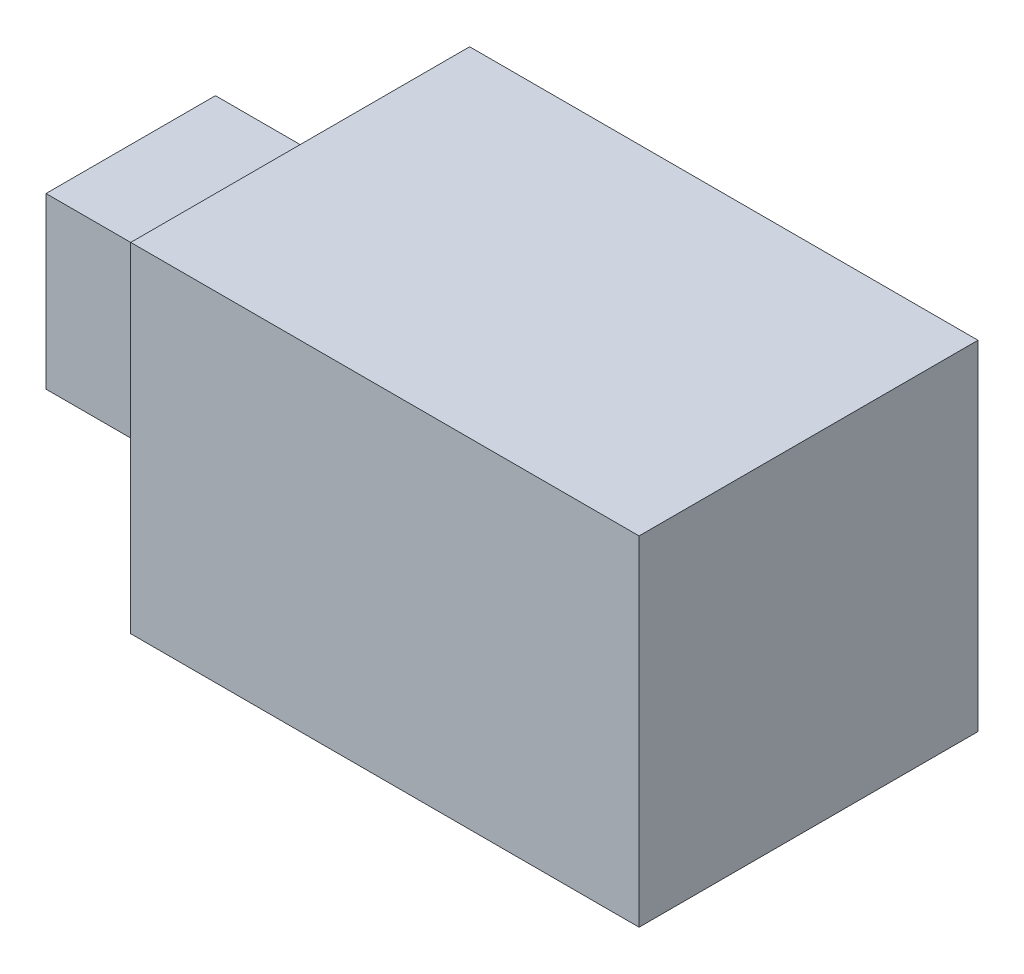
ISO-10303-21;
HEADER;
FILE_DESCRIPTION(('STEP AP214'),'2;1');
FILE_NAME('part.step','',(''),(''),'','','');
FILE_SCHEMA(('AUTOMOTIVE_DESIGN { 1 0 10303 214 1 1 1 1 }'));
ENDSEC;
DATA;
#1=APPLICATION_CONTEXT('core data for automotive mechanical design processes');
#2=APPLICATION_PROTOCOL_DEFINITION('international standard','automotive_design',2000,#1);
#3=PRODUCT_CONTEXT('',#1,'mechanical');
#4=PRODUCT('Part','Part','',(#3));
#5=PRODUCT_RELATED_PRODUCT_CATEGORY('part','',(#4));
#6=PRODUCT_DEFINITION_FORMATION('','',#4);
#7=PRODUCT_DEFINITION_CONTEXT('part definition',#1,'design');
#8=PRODUCT_DEFINITION('design','',#6,#7);
#9=PRODUCT_DEFINITION_SHAPE('','',#8);
#10=(LENGTH_UNIT() NAMED_UNIT(*) SI_UNIT(.MILLI.,.METRE.));
#11=(NAMED_UNIT(*) PLANE_ANGLE_UNIT() SI_UNIT($,.RADIAN.));
#12=(NAMED_UNIT(*) SI_UNIT($,.STERADIAN.) SOLID_ANGLE_UNIT());
#13=UNCERTAINTY_MEASURE_WITH_UNIT(LENGTH_MEASURE(1.E-05),#10,'distance_accuracy_value','');
#14=(GEOMETRIC_REPRESENTATION_CONTEXT(3) GLOBAL_UNCERTAINTY_ASSIGNED_CONTEXT((#13)) GLOBAL_UNIT_ASSIGNED_CONTEXT((#10,
#11,#12)) REPRESENTATION_CONTEXT('',''));
#15=CARTESIAN_POINT('',(0.,0.,0.));
#16=DIRECTION('',(0.,0.,1.));
#17=DIRECTION('',(1.,0.,0.));
#18=AXIS2_PLACEMENT_3D('',#15,#16,#17);
#19=CARTESIAN_POINT('',(12.7,6.35,-6.35));
#20=DIRECTION('',(0.,0.,1.));
#21=DIRECTION('',(0.,-1.,0.));
#22=AXIS2_PLACEMENT_3D('',#19,#20,#21);
#23=PLANE('',#22);
#24=DIRECTION('',(0.,1.,0.));
#25=VECTOR('',#24,1.);
#26=CARTESIAN_POINT('',(0.,6.35,-6.35));
#27=LINE('',#26,#25);
#28=CARTESIAN_POINT('',(0.,-6.35,-6.35));
#29=VERTEX_POINT('',#28);
#30=CARTESIAN_POINT('',(0.,6.35,-6.35));
#31=VERTEX_POINT('',#30);
#32=EDGE_CURVE('E147',#29,#31,#27,.T.);
#33=ORIENTED_EDGE('',*,*,#32,.T.);
#34=DIRECTION('',(-1.,0.,0.));
#35=VECTOR('',#34,1.);
#36=CARTESIAN_POINT('',(12.7,6.35,-6.35));
#37=LINE('',#36,#35);
#38=CARTESIAN_POINT('',(12.7,6.35,-6.35));
#39=VERTEX_POINT('',#38);
#40=EDGE_CURVE('E11',#39,#31,#37,.T.);
#41=ORIENTED_EDGE('',*,*,#40,.F.);
#42=DIRECTION('',(0.,1.,0.));
#43=VECTOR('',#42,1.);
#44=CARTESIAN_POINT('',(12.7,6.35,-6.35));
#45=LINE('',#44,#43);
#46=CARTESIAN_POINT('',(12.7,-6.35,-6.35));
#47=VERTEX_POINT('',#46);
#48=EDGE_CURVE('E158',#47,#39,#45,.T.);
#49=ORIENTED_EDGE('',*,*,#48,.F.);
#50=DIRECTION('',(-1.,0.,0.));
#51=VECTOR('',#50,1.);
#52=CARTESIAN_POINT('',(12.7,-6.35,-6.35));
#53=LINE('',#52,#51);
#54=EDGE_CURVE('E171',#47,#29,#53,.T.);
#55=ORIENTED_EDGE('',*,*,#54,.T.);
#56=EDGE_LOOP('',(#33,#41,#49,#55));
#57=FACE_BOUND('',#56,.T.);
#58=ADVANCED_FACE('F45',(#57),#23,.F.);
#59=CARTESIAN_POINT('',(12.7,6.35,6.35));
#60=DIRECTION('',(0.,-1.,0.));
#61=DIRECTION('',(0.,0.,-1.));
#62=AXIS2_PLACEMENT_3D('',#59,#60,#61);
#63=PLANE('',#62);
#64=DIRECTION('',(0.,0.,1.));
#65=VECTOR('',#64,1.);
#66=CARTESIAN_POINT('',(0.,6.35,6.35));
#67=LINE('',#66,#65);
#68=CARTESIAN_POINT('',(0.,6.35,6.35));
#69=VERTEX_POINT('',#68);
#70=EDGE_CURVE('E152',#31,#69,#67,.T.);
#71=ORIENTED_EDGE('',*,*,#70,.T.);
#72=DIRECTION('',(-1.,0.,0.));
#73=VECTOR('',#72,1.);
#74=CARTESIAN_POINT('',(12.7,6.35,6.35));
#75=LINE('',#74,#73);
#76=CARTESIAN_POINT('',(12.7,6.35,6.35));
#77=VERTEX_POINT('',#76);
#78=EDGE_CURVE('E54',#77,#69,#75,.T.);
#79=ORIENTED_EDGE('',*,*,#78,.F.);
#80=DIRECTION('',(0.,0.,1.));
#81=VECTOR('',#80,1.);
#82=CARTESIAN_POINT('',(12.7,6.35,6.35));
#83=LINE('',#82,#81);
#84=EDGE_CURVE('E88',#39,#77,#83,.T.);
#85=ORIENTED_EDGE('',*,*,#84,.F.);
#86=ORIENTED_EDGE('',*,*,#40,.T.);
#87=EDGE_LOOP('',(#71,#79,#85,#86));
#88=FACE_BOUND('',#87,.T.);
#89=ADVANCED_FACE('F204',(#88),#63,.F.);
#90=CARTESIAN_POINT('',(12.7,6.35,6.35));
#91=DIRECTION('',(0.,0.,-1.));
#92=DIRECTION('',(0.,1.,0.));
#93=AXIS2_PLACEMENT_3D('',#90,#91,#92);
#94=PLANE('',#93);
#95=DIRECTION('',(0.,-1.,0.));
#96=VECTOR('',#95,1.);
#97=CARTESIAN_POINT('',(0.,6.35,6.35));
#98=LINE('',#97,#96);
#99=CARTESIAN_POINT('',(0.,-6.35,6.35));
#100=VERTEX_POINT('',#99);
#101=EDGE_CURVE('E78',#69,#100,#98,.T.);
#102=ORIENTED_EDGE('',*,*,#101,.T.);
#103=DIRECTION('',(-1.,0.,0.));
#104=VECTOR('',#103,1.);
#105=CARTESIAN_POINT('',(12.7,-6.35,6.35));
#106=LINE('',#105,#104);
#107=CARTESIAN_POINT('',(12.7,-6.35,6.35));
#108=VERTEX_POINT('',#107);
#109=EDGE_CURVE('E62',#108,#100,#106,.T.);
#110=ORIENTED_EDGE('',*,*,#109,.F.);
#111=DIRECTION('',(0.,-1.,0.));
#112=VECTOR('',#111,1.);
#113=CARTESIAN_POINT('',(12.7,6.35,6.35));
#114=LINE('',#113,#112);
#115=EDGE_CURVE('E164',#77,#108,#114,.T.);
#116=ORIENTED_EDGE('',*,*,#115,.F.);
#117=ORIENTED_EDGE('',*,*,#78,.T.);
#118=EDGE_LOOP('',(#102,#110,#116,#117));
#119=FACE_BOUND('',#118,.T.);
#120=ADVANCED_FACE('F183',(#119),#94,.F.);
#121=CARTESIAN_POINT('',(12.7,-6.35,6.35));
#122=DIRECTION('',(0.,1.,0.));
#123=DIRECTION('',(0.,0.,1.));
#124=AXIS2_PLACEMENT_3D('',#121,#122,#123);
#125=PLANE('',#124);
#126=DIRECTION('',(0.,0.,-1.));
#127=VECTOR('',#126,1.);
#128=CARTESIAN_POINT('',(0.,-6.35,6.35));
#129=LINE('',#128,#127);
#130=EDGE_CURVE('E83',#100,#29,#129,.T.);
#131=ORIENTED_EDGE('',*,*,#130,.T.);
#132=ORIENTED_EDGE('',*,*,#54,.F.);
#133=DIRECTION('',(0.,0.,-1.));
#134=VECTOR('',#133,1.);
#135=CARTESIAN_POINT('',(12.7,-6.35,6.35));
#136=LINE('',#135,#134);
#137=EDGE_CURVE('E168',#108,#47,#136,.T.);
#138=ORIENTED_EDGE('',*,*,#137,.F.);
#139=ORIENTED_EDGE('',*,*,#109,.T.);
#140=EDGE_LOOP('',(#131,#132,#138,#139));
#141=FACE_BOUND('',#140,.T.);
#142=ADVANCED_FACE('F188',(#141),#125,.F.);
#143=CARTESIAN_POINT('',(0.,0.,0.));
#144=DIRECTION('',(1.,0.,0.));
#145=DIRECTION('',(0.,0.,-1.));
#146=AXIS2_PLACEMENT_3D('',#143,#144,#145);
#147=PLANE('',#146);
#148=ORIENTED_EDGE('',*,*,#32,.F.);
#149=ORIENTED_EDGE('',*,*,#130,.F.);
#150=ORIENTED_EDGE('',*,*,#101,.F.);
#151=ORIENTED_EDGE('',*,*,#70,.F.);
#152=EDGE_LOOP('',(#148,#149,#150,#151));
#153=FACE_BOUND('',#152,.T.);
#154=ADVANCED_FACE('F186',(#153),#147,.F.);
#155=CARTESIAN_POINT('',(12.7,0.,0.));
#156=DIRECTION('',(1.,0.,0.));
#157=DIRECTION('',(0.,0.,-1.));
#158=AXIS2_PLACEMENT_3D('',#155,#156,#157);
#159=PLANE('',#158);
#160=DIRECTION('',(0.,1.,0.));
#161=VECTOR('',#160,1.);
#162=CARTESIAN_POINT('',(12.7,12.7,-12.7));
#163=LINE('',#162,#161);
#164=CARTESIAN_POINT('',(12.7,-12.7,-12.7));
#165=VERTEX_POINT('',#164);
#166=CARTESIAN_POINT('',(12.7,12.7,-12.7));
#167=VERTEX_POINT('',#166);
#168=EDGE_CURVE('E145',#165,#167,#163,.T.);
#169=ORIENTED_EDGE('',*,*,#168,.F.);
#170=DIRECTION('',(0.,0.,-1.));
#171=VECTOR('',#170,1.);
#172=CARTESIAN_POINT('',(12.7,-12.7,12.7));
#173=LINE('',#172,#171);
#174=CARTESIAN_POINT('',(12.7,-12.7,12.7));
#175=VERTEX_POINT('',#174);
#176=EDGE_CURVE('E141',#175,#165,#173,.T.);
#177=ORIENTED_EDGE('',*,*,#176,.F.);
#178=DIRECTION('',(0.,-1.,0.));
#179=VECTOR('',#178,1.);
#180=CARTESIAN_POINT('',(12.7,12.7,12.7));
#181=LINE('',#180,#179);
#182=CARTESIAN_POINT('',(12.7,12.7,12.7));
#183=VERTEX_POINT('',#182);
#184=EDGE_CURVE('E231',#183,#175,#181,.T.);
#185=ORIENTED_EDGE('',*,*,#184,.F.);
#186=DIRECTION('',(0.,0.,1.));
#187=VECTOR('',#186,1.);
#188=CARTESIAN_POINT('',(12.7,12.7,12.7));
#189=LINE('',#188,#187);
#190=EDGE_CURVE('E235',#167,#183,#189,.T.);
#191=ORIENTED_EDGE('',*,*,#190,.F.);
#192=EDGE_LOOP('',(#169,#177,#185,#191));
#193=FACE_BOUND('',#192,.T.);
#194=ORIENTED_EDGE('',*,*,#137,.T.);
#195=ORIENTED_EDGE('',*,*,#48,.T.);
#196=ORIENTED_EDGE('',*,*,#84,.T.);
#197=ORIENTED_EDGE('',*,*,#115,.T.);
#198=EDGE_LOOP('',(#194,#195,#196,#197));
#199=FACE_BOUND('',#198,.T.);
#200=ADVANCED_FACE('F190',(#193,#199),#159,.F.);
#201=CARTESIAN_POINT('',(50.8,12.7,-12.7));
#202=DIRECTION('',(0.,0.,1.));
#203=DIRECTION('',(0.,-1.,0.));
#204=AXIS2_PLACEMENT_3D('',#201,#202,#203);
#205=PLANE('',#204);
#206=ORIENTED_EDGE('',*,*,#168,.T.);
#207=DIRECTION('',(-1.,0.,0.));
#208=VECTOR('',#207,1.);
#209=CARTESIAN_POINT('',(50.8,12.7,-12.7));
#210=LINE('',#209,#208);
#211=CARTESIAN_POINT('',(50.8,12.7,-12.7));
#212=VERTEX_POINT('',#211);
#213=EDGE_CURVE('E123',#212,#167,#210,.T.);
#214=ORIENTED_EDGE('',*,*,#213,.F.);
#215=DIRECTION('',(0.,1.,0.));
#216=VECTOR('',#215,1.);
#217=CARTESIAN_POINT('',(50.8,12.7,-12.7));
#218=LINE('',#217,#216);
#219=CARTESIAN_POINT('',(50.8,-12.7,-12.7));
#220=VERTEX_POINT('',#219);
#221=EDGE_CURVE('E131',#220,#212,#218,.T.);
#222=ORIENTED_EDGE('',*,*,#221,.F.);
#223=DIRECTION('',(-1.,0.,0.));
#224=VECTOR('',#223,1.);
#225=CARTESIAN_POINT('',(50.8,-12.7,-12.7));
#226=LINE('',#225,#224);
#227=EDGE_CURVE('E227',#220,#165,#226,.T.);
#228=ORIENTED_EDGE('',*,*,#227,.T.);
#229=EDGE_LOOP('',(#206,#214,#222,#228));
#230=FACE_BOUND('',#229,.T.);
#231=ADVANCED_FACE('F143',(#230),#205,.F.);
#232=CARTESIAN_POINT('',(50.8,12.7,12.7));
#233=DIRECTION('',(0.,-1.,0.));
#234=DIRECTION('',(0.,0.,-1.));
#235=AXIS2_PLACEMENT_3D('',#232,#233,#234);
#236=PLANE('',#235);
#237=ORIENTED_EDGE('',*,*,#190,.T.);
#238=DIRECTION('',(-1.,0.,0.));
#239=VECTOR('',#238,1.);
#240=CARTESIAN_POINT('',(50.8,12.7,12.7));
#241=LINE('',#240,#239);
#242=CARTESIAN_POINT('',(50.8,12.7,12.7));
#243=VERTEX_POINT('',#242);
#244=EDGE_CURVE('E126',#243,#183,#241,.T.);
#245=ORIENTED_EDGE('',*,*,#244,.F.);
#246=DIRECTION('',(0.,0.,1.));
#247=VECTOR('',#246,1.);
#248=CARTESIAN_POINT('',(50.8,12.7,12.7));
#249=LINE('',#248,#247);
#250=EDGE_CURVE('E119',#212,#243,#249,.T.);
#251=ORIENTED_EDGE('',*,*,#250,.F.);
#252=ORIENTED_EDGE('',*,*,#213,.T.);
#253=EDGE_LOOP('',(#237,#245,#251,#252));
#254=FACE_BOUND('',#253,.T.);
#255=ADVANCED_FACE('F121',(#254),#236,.F.);
#256=CARTESIAN_POINT('',(50.8,12.7,12.7));
#257=DIRECTION('',(0.,0.,-1.));
#258=DIRECTION('',(0.,1.,0.));
#259=AXIS2_PLACEMENT_3D('',#256,#257,#258);
#260=PLANE('',#259);
#261=ORIENTED_EDGE('',*,*,#184,.T.);
#262=DIRECTION('',(-1.,0.,0.));
#263=VECTOR('',#262,1.);
#264=CARTESIAN_POINT('',(50.8,-12.7,12.7));
#265=LINE('',#264,#263);
#266=CARTESIAN_POINT('',(50.8,-12.7,12.7));
#267=VERTEX_POINT('',#266);
#268=EDGE_CURVE('E154',#267,#175,#265,.T.);
#269=ORIENTED_EDGE('',*,*,#268,.F.);
#270=DIRECTION('',(0.,-1.,0.));
#271=VECTOR('',#270,1.);
#272=CARTESIAN_POINT('',(50.8,12.7,12.7));
#273=LINE('',#272,#271);
#274=EDGE_CURVE('E130',#243,#267,#273,.T.);
#275=ORIENTED_EDGE('',*,*,#274,.F.);
#276=ORIENTED_EDGE('',*,*,#244,.T.);
#277=EDGE_LOOP('',(#261,#269,#275,#276));
#278=FACE_BOUND('',#277,.T.);
#279=ADVANCED_FACE('F216',(#278),#260,.F.);
#280=CARTESIAN_POINT('',(50.8,-12.7,12.7));
#281=DIRECTION('',(0.,1.,0.));
#282=DIRECTION('',(0.,0.,1.));
#283=AXIS2_PLACEMENT_3D('',#280,#281,#282);
#284=PLANE('',#283);
#285=ORIENTED_EDGE('',*,*,#176,.T.);
#286=ORIENTED_EDGE('',*,*,#227,.F.);
#287=DIRECTION('',(0.,0.,-1.));
#288=VECTOR('',#287,1.);
#289=CARTESIAN_POINT('',(50.8,-12.7,12.7));
#290=LINE('',#289,#288);
#291=EDGE_CURVE('E136',#267,#220,#290,.T.);
#292=ORIENTED_EDGE('',*,*,#291,.F.);
#293=ORIENTED_EDGE('',*,*,#268,.T.);
#294=EDGE_LOOP('',(#285,#286,#292,#293));
#295=FACE_BOUND('',#294,.T.);
#296=ADVANCED_FACE('F218',(#295),#284,.F.);
#297=CARTESIAN_POINT('',(50.8,0.,0.));
#298=DIRECTION('',(1.,0.,0.));
#299=DIRECTION('',(0.,0.,-1.));
#300=AXIS2_PLACEMENT_3D('',#297,#298,#299);
#301=PLANE('',#300);
#302=ORIENTED_EDGE('',*,*,#221,.T.);
#303=ORIENTED_EDGE('',*,*,#250,.T.);
#304=ORIENTED_EDGE('',*,*,#274,.T.);
#305=ORIENTED_EDGE('',*,*,#291,.T.);
#306=EDGE_LOOP('',(#302,#303,#304,#305));
#307=FACE_BOUND('',#306,.T.);
#308=ADVANCED_FACE('F134',(#307),#301,.T.);
#309=CLOSED_SHELL('',(#58,#89,#120,#142,#154,#200,#231,#255,#279,#296,#308));
#310=MANIFOLD_SOLID_BREP('B2',#309);
#311=ADVANCED_BREP_SHAPE_REPRESENTATION('',(#18,#310),#14);
#312=SHAPE_DEFINITION_REPRESENTATION(#9,#311);
ENDSEC;
END-ISO-10303-21;
